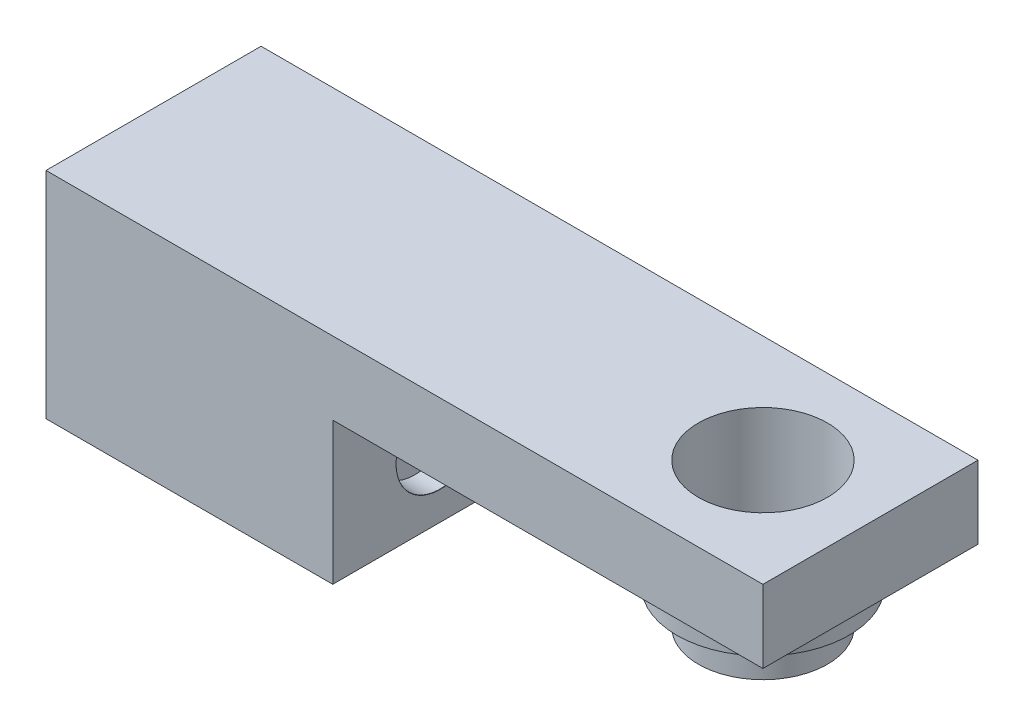
ISO-10303-21;
HEADER;
FILE_DESCRIPTION(('STEP AP214'),'2;1');
FILE_NAME('part.step','',(''),(''),'','','');
FILE_SCHEMA(('AUTOMOTIVE_DESIGN { 1 0 10303 214 1 1 1 1 }'));
ENDSEC;
DATA;
#1=APPLICATION_CONTEXT('core data for automotive mechanical design processes');
#2=APPLICATION_PROTOCOL_DEFINITION('international standard','automotive_design',2000,#1);
#3=PRODUCT_CONTEXT('',#1,'mechanical');
#4=PRODUCT('Part','Part','',(#3));
#5=PRODUCT_RELATED_PRODUCT_CATEGORY('part','',(#4));
#6=PRODUCT_DEFINITION_FORMATION('','',#4);
#7=PRODUCT_DEFINITION_CONTEXT('part definition',#1,'design');
#8=PRODUCT_DEFINITION('design','',#6,#7);
#9=PRODUCT_DEFINITION_SHAPE('','',#8);
#10=(LENGTH_UNIT() NAMED_UNIT(*) SI_UNIT(.MILLI.,.METRE.));
#11=(NAMED_UNIT(*) PLANE_ANGLE_UNIT() SI_UNIT($,.RADIAN.));
#12=(NAMED_UNIT(*) SI_UNIT($,.STERADIAN.) SOLID_ANGLE_UNIT());
#13=UNCERTAINTY_MEASURE_WITH_UNIT(LENGTH_MEASURE(1.E-05),#10,'distance_accuracy_value','');
#14=(GEOMETRIC_REPRESENTATION_CONTEXT(3) GLOBAL_UNCERTAINTY_ASSIGNED_CONTEXT((#13)) GLOBAL_UNIT_ASSIGNED_CONTEXT((#10,
#11,#12)) REPRESENTATION_CONTEXT('',''));
#15=CARTESIAN_POINT('',(0.,0.,0.));
#16=DIRECTION('',(0.,0.,1.));
#17=DIRECTION('',(1.,0.,0.));
#18=AXIS2_PLACEMENT_3D('',#15,#16,#17);
#19=CARTESIAN_POINT('',(40.,0.,0.));
#20=DIRECTION('',(-1.,0.,0.));
#21=DIRECTION('',(0.,0.,1.));
#22=AXIS2_PLACEMENT_3D('',#19,#20,#21);
#23=PLANE('',#22);
#24=CARTESIAN_POINT('',(40.,2.48247175305494,24.681970174111));
#25=DIRECTION('',(1.,0.,0.));
#26=DIRECTION('',(0.,0.,-1.));
#27=AXIS2_PLACEMENT_3D('',#24,#25,#26);
#28=CIRCLE('',#27,6.144);
#29=CARTESIAN_POINT('',(40.,2.48247175305494,18.537970174111));
#30=VERTEX_POINT('',#29);
#31=EDGE_CURVE('E244',#30,#30,#28,.T.);
#32=ORIENTED_EDGE('',*,*,#31,.F.);
#33=EDGE_LOOP('',(#32));
#34=FACE_BOUND('',#33,.T.);
#35=DIRECTION('',(0.,0.,-1.));
#36=VECTOR('',#35,1.);
#37=CARTESIAN_POINT('',(40.,12.1952160658731,39.6578468441171));
#38=LINE('',#37,#36);
#39=CARTESIAN_POINT('',(40.,12.1952160658731,39.6578468441171));
#40=VERTEX_POINT('',#39);
#41=CARTESIAN_POINT('',(40.,12.1952160658731,9.65784684411711));
#42=VERTEX_POINT('',#41);
#43=EDGE_CURVE('E50',#40,#42,#38,.T.);
#44=ORIENTED_EDGE('',*,*,#43,.F.);
#45=DIRECTION('',(0.,-1.,0.));
#46=VECTOR('',#45,1.);
#47=CARTESIAN_POINT('',(40.,-7.63901148226845,39.6578468441171));
#48=LINE('',#47,#46);
#49=CARTESIAN_POINT('',(40.,-7.63901148226845,39.6578468441171));
#50=VERTEX_POINT('',#49);
#51=EDGE_CURVE('E87',#40,#50,#48,.T.);
#52=ORIENTED_EDGE('',*,*,#51,.T.);
#53=DIRECTION('',(0.,0.,-1.));
#54=VECTOR('',#53,1.);
#55=CARTESIAN_POINT('',(40.,-7.63901148226845,39.6578468441171));
#56=LINE('',#55,#54);
#57=CARTESIAN_POINT('',(40.,-7.63901148226845,9.65784684411711));
#58=VERTEX_POINT('',#57);
#59=EDGE_CURVE('E56',#50,#58,#56,.T.);
#60=ORIENTED_EDGE('',*,*,#59,.T.);
#61=DIRECTION('',(0.,1.,0.));
#62=VECTOR('',#61,1.);
#63=CARTESIAN_POINT('',(40.,-7.63901148226845,9.65784684411711));
#64=LINE('',#63,#62);
#65=EDGE_CURVE('E98',#58,#42,#64,.T.);
#66=ORIENTED_EDGE('',*,*,#65,.T.);
#67=EDGE_LOOP('',(#44,#52,#60,#66));
#68=FACE_BOUND('',#67,.T.);
#69=ADVANCED_FACE('F35',(#34,#68),#23,.F.);
#70=CARTESIAN_POINT('',(40.,-7.63901148226845,39.6578468441171));
#71=DIRECTION('',(0.,0.,-1.));
#72=DIRECTION('',(-1.,0.,0.));
#73=AXIS2_PLACEMENT_3D('',#70,#71,#72);
#74=PLANE('',#73);
#75=DIRECTION('',(0.,-1.,0.));
#76=VECTOR('',#75,1.);
#77=CARTESIAN_POINT('',(0.,-7.63901148226845,39.6578468441171));
#78=LINE('',#77,#76);
#79=CARTESIAN_POINT('',(0.,22.3609885177315,39.6578468441171));
#80=VERTEX_POINT('',#79);
#81=CARTESIAN_POINT('',(0.,-7.63901148226845,39.6578468441171));
#82=VERTEX_POINT('',#81);
#83=EDGE_CURVE('E94',#80,#82,#78,.T.);
#84=ORIENTED_EDGE('',*,*,#83,.T.);
#85=DIRECTION('',(-1.,0.,0.));
#86=VECTOR('',#85,1.);
#87=CARTESIAN_POINT('',(40.,-7.63901148226845,39.6578468441171));
#88=LINE('',#87,#86);
#89=EDGE_CURVE('E43',#50,#82,#88,.T.);
#90=ORIENTED_EDGE('',*,*,#89,.F.);
#91=ORIENTED_EDGE('',*,*,#51,.F.);
#92=DIRECTION('',(-1.,0.,0.));
#93=VECTOR('',#92,1.);
#94=CARTESIAN_POINT('',(100.,12.1952160658731,39.6578468441171));
#95=LINE('',#94,#93);
#96=CARTESIAN_POINT('',(100.,12.1952160658731,39.6578468441171));
#97=VERTEX_POINT('',#96);
#98=EDGE_CURVE('E103',#97,#40,#95,.T.);
#99=ORIENTED_EDGE('',*,*,#98,.F.);
#100=DIRECTION('',(0.,-1.,0.));
#101=VECTOR('',#100,1.);
#102=CARTESIAN_POINT('',(100.,22.3609885177315,39.6578468441171));
#103=LINE('',#102,#101);
#104=CARTESIAN_POINT('',(100.,22.3609885177315,39.6578468441171));
#105=VERTEX_POINT('',#104);
#106=EDGE_CURVE('E97',#105,#97,#103,.T.);
#107=ORIENTED_EDGE('',*,*,#106,.F.);
#108=DIRECTION('',(-1.,0.,0.));
#109=VECTOR('',#108,1.);
#110=CARTESIAN_POINT('',(40.,22.3609885177315,39.6578468441171));
#111=LINE('',#110,#109);
#112=EDGE_CURVE('E80',#105,#80,#111,.T.);
#113=ORIENTED_EDGE('',*,*,#112,.T.);
#114=EDGE_LOOP('',(#84,#90,#91,#99,#107,#113));
#115=FACE_BOUND('',#114,.T.);
#116=ADVANCED_FACE('F37',(#115),#74,.F.);
#117=CARTESIAN_POINT('',(40.,-7.63901148226845,39.6578468441171));
#118=DIRECTION('',(0.,1.,0.));
#119=DIRECTION('',(0.,0.,1.));
#120=AXIS2_PLACEMENT_3D('',#117,#118,#119);
#121=PLANE('',#120);
#122=DIRECTION('',(0.,0.,-1.));
#123=VECTOR('',#122,1.);
#124=CARTESIAN_POINT('',(0.,-7.63901148226845,39.6578468441171));
#125=LINE('',#124,#123);
#126=CARTESIAN_POINT('',(0.,-7.63901148226845,9.65784684411711));
#127=VERTEX_POINT('',#126);
#128=EDGE_CURVE('E101',#82,#127,#125,.T.);
#129=ORIENTED_EDGE('',*,*,#128,.T.);
#130=DIRECTION('',(-1.,0.,0.));
#131=VECTOR('',#130,1.);
#132=CARTESIAN_POINT('',(40.,-7.63901148226845,9.65784684411711));
#133=LINE('',#132,#131);
#134=EDGE_CURVE('E114',#58,#127,#133,.T.);
#135=ORIENTED_EDGE('',*,*,#134,.F.);
#136=ORIENTED_EDGE('',*,*,#59,.F.);
#137=ORIENTED_EDGE('',*,*,#89,.T.);
#138=EDGE_LOOP('',(#129,#135,#136,#137));
#139=FACE_BOUND('',#138,.T.);
#140=ADVANCED_FACE('F117',(#139),#121,.F.);
#141=CARTESIAN_POINT('',(40.,-7.63901148226845,9.65784684411711));
#142=DIRECTION('',(0.,0.,1.));
#143=DIRECTION('',(1.,0.,0.));
#144=AXIS2_PLACEMENT_3D('',#141,#142,#143);
#145=PLANE('',#144);
#146=DIRECTION('',(0.,1.,0.));
#147=VECTOR('',#146,1.);
#148=CARTESIAN_POINT('',(0.,-7.63901148226845,9.65784684411711));
#149=LINE('',#148,#147);
#150=CARTESIAN_POINT('',(0.,22.3609885177315,9.65784684411711));
#151=VERTEX_POINT('',#150);
#152=EDGE_CURVE('E88',#127,#151,#149,.T.);
#153=ORIENTED_EDGE('',*,*,#152,.T.);
#154=DIRECTION('',(-1.,0.,0.));
#155=VECTOR('',#154,1.);
#156=CARTESIAN_POINT('',(40.,22.3609885177315,9.65784684411711));
#157=LINE('',#156,#155);
#158=CARTESIAN_POINT('',(100.,22.3609885177315,9.65784684411711));
#159=VERTEX_POINT('',#158);
#160=EDGE_CURVE('E83',#159,#151,#157,.T.);
#161=ORIENTED_EDGE('',*,*,#160,.F.);
#162=DIRECTION('',(0.,1.,0.));
#163=VECTOR('',#162,1.);
#164=CARTESIAN_POINT('',(100.,22.3609885177315,9.65784684411711));
#165=LINE('',#164,#163);
#166=CARTESIAN_POINT('',(100.,12.1952160658731,9.65784684411711));
#167=VERTEX_POINT('',#166);
#168=EDGE_CURVE('E133',#167,#159,#165,.T.);
#169=ORIENTED_EDGE('',*,*,#168,.F.);
#170=DIRECTION('',(-1.,0.,0.));
#171=VECTOR('',#170,1.);
#172=CARTESIAN_POINT('',(100.,12.1952160658731,9.65784684411711));
#173=LINE('',#172,#171);
#174=EDGE_CURVE('E107',#167,#42,#173,.T.);
#175=ORIENTED_EDGE('',*,*,#174,.T.);
#176=ORIENTED_EDGE('',*,*,#65,.F.);
#177=ORIENTED_EDGE('',*,*,#134,.T.);
#178=EDGE_LOOP('',(#153,#161,#169,#175,#176,#177));
#179=FACE_BOUND('',#178,.T.);
#180=ADVANCED_FACE('F147',(#179),#145,.F.);
#181=CARTESIAN_POINT('',(40.,22.3609885177315,39.6578468441171));
#182=DIRECTION('',(0.,-1.,0.));
#183=DIRECTION('',(0.,0.,-1.));
#184=AXIS2_PLACEMENT_3D('',#181,#182,#183);
#185=PLANE('',#184);
#186=CARTESIAN_POINT('',(85.,22.3609885177315,24.6578468441171));
#187=DIRECTION('',(0.,1.,0.));
#188=DIRECTION('',(0.,0.,1.));
#189=AXIS2_PLACEMENT_3D('',#186,#187,#188);
#190=CIRCLE('',#189,9.);
#191=CARTESIAN_POINT('',(85.,22.3609885177315,33.6578468441171));
#192=VERTEX_POINT('',#191);
#193=EDGE_CURVE('E245',#192,#192,#190,.T.);
#194=ORIENTED_EDGE('',*,*,#193,.F.);
#195=EDGE_LOOP('',(#194));
#196=FACE_BOUND('',#195,.T.);
#197=DIRECTION('',(0.,0.,1.));
#198=VECTOR('',#197,1.);
#199=CARTESIAN_POINT('',(0.,22.3609885177315,39.6578468441171));
#200=LINE('',#199,#198);
#201=EDGE_CURVE('E76',#151,#80,#200,.T.);
#202=ORIENTED_EDGE('',*,*,#201,.T.);
#203=ORIENTED_EDGE('',*,*,#112,.F.);
#204=DIRECTION('',(0.,0.,1.));
#205=VECTOR('',#204,1.);
#206=CARTESIAN_POINT('',(100.,22.3609885177315,39.6578468441171));
#207=LINE('',#206,#205);
#208=EDGE_CURVE('E136',#159,#105,#207,.T.);
#209=ORIENTED_EDGE('',*,*,#208,.F.);
#210=ORIENTED_EDGE('',*,*,#160,.T.);
#211=EDGE_LOOP('',(#202,#203,#209,#210));
#212=FACE_BOUND('',#211,.T.);
#213=ADVANCED_FACE('F78',(#196,#212),#185,.F.);
#214=CARTESIAN_POINT('',(0.,0.,0.));
#215=DIRECTION('',(-1.,0.,0.));
#216=DIRECTION('',(0.,0.,1.));
#217=AXIS2_PLACEMENT_3D('',#214,#215,#216);
#218=PLANE('',#217);
#219=CARTESIAN_POINT('',(0.,2.48247175305494,24.681970174111));
#220=DIRECTION('',(1.,0.,0.));
#221=DIRECTION('',(0.,0.,-1.));
#222=AXIS2_PLACEMENT_3D('',#219,#220,#221);
#223=CIRCLE('',#222,2.74999999999999);
#224=CARTESIAN_POINT('',(0.,2.48247175305494,21.931970174111));
#225=VERTEX_POINT('',#224);
#226=EDGE_CURVE('E178',#225,#225,#223,.T.);
#227=ORIENTED_EDGE('',*,*,#226,.T.);
#228=EDGE_LOOP('',(#227));
#229=FACE_BOUND('',#228,.T.);
#230=ORIENTED_EDGE('',*,*,#83,.F.);
#231=ORIENTED_EDGE('',*,*,#201,.F.);
#232=ORIENTED_EDGE('',*,*,#152,.F.);
#233=ORIENTED_EDGE('',*,*,#128,.F.);
#234=EDGE_LOOP('',(#230,#231,#232,#233));
#235=FACE_BOUND('',#234,.T.);
#236=ADVANCED_FACE('F100',(#229,#235),#218,.T.);
#237=CARTESIAN_POINT('',(100.,12.1952160658731,39.6578468441171));
#238=DIRECTION('',(0.,1.,0.));
#239=DIRECTION('',(0.,0.,1.));
#240=AXIS2_PLACEMENT_3D('',#237,#238,#239);
#241=PLANE('',#240);
#242=CARTESIAN_POINT('',(85.,12.1952160658731,24.6578468441171));
#243=DIRECTION('',(0.,1.,0.));
#244=DIRECTION('',(0.,0.,1.));
#245=AXIS2_PLACEMENT_3D('',#242,#243,#244);
#246=CIRCLE('',#245,12.);
#247=CARTESIAN_POINT('',(85.,12.1952160658731,36.6578468441171));
#248=VERTEX_POINT('',#247);
#249=EDGE_CURVE('E11',#248,#248,#246,.F.);
#250=ORIENTED_EDGE('',*,*,#249,.F.);
#251=EDGE_LOOP('',(#250));
#252=FACE_BOUND('',#251,.T.);
#253=ORIENTED_EDGE('',*,*,#43,.T.);
#254=ORIENTED_EDGE('',*,*,#174,.F.);
#255=DIRECTION('',(0.,0.,-1.));
#256=VECTOR('',#255,1.);
#257=CARTESIAN_POINT('',(100.,12.1952160658731,39.6578468441171));
#258=LINE('',#257,#256);
#259=EDGE_CURVE('E127',#97,#167,#258,.T.);
#260=ORIENTED_EDGE('',*,*,#259,.F.);
#261=ORIENTED_EDGE('',*,*,#98,.T.);
#262=EDGE_LOOP('',(#253,#254,#260,#261));
#263=FACE_BOUND('',#262,.T.);
#264=ADVANCED_FACE('F122',(#252,#263),#241,.F.);
#265=CARTESIAN_POINT('',(100.,0.,0.));
#266=DIRECTION('',(1.,0.,0.));
#267=DIRECTION('',(0.,0.,-1.));
#268=AXIS2_PLACEMENT_3D('',#265,#266,#267);
#269=PLANE('',#268);
#270=ORIENTED_EDGE('',*,*,#106,.T.);
#271=ORIENTED_EDGE('',*,*,#259,.T.);
#272=ORIENTED_EDGE('',*,*,#168,.T.);
#273=ORIENTED_EDGE('',*,*,#208,.T.);
#274=EDGE_LOOP('',(#270,#271,#272,#273));
#275=FACE_BOUND('',#274,.T.);
#276=ADVANCED_FACE('F135',(#275),#269,.T.);
#277=CARTESIAN_POINT('',(85.,7.19521606587315,24.6578468441171));
#278=DIRECTION('',(0.,1.,0.));
#279=DIRECTION('',(0.,0.,1.));
#280=AXIS2_PLACEMENT_3D('',#277,#278,#279);
#281=CYLINDRICAL_SURFACE('',#280,12.);
#282=CARTESIAN_POINT('',(85.,7.19521606587315,24.6578468441171));
#283=DIRECTION('',(0.,-1.,0.));
#284=DIRECTION('',(0.,0.,-1.));
#285=AXIS2_PLACEMENT_3D('',#282,#283,#284);
#286=CIRCLE('',#285,12.);
#287=CARTESIAN_POINT('',(85.,7.19521606587315,12.6578468441171));
#288=VERTEX_POINT('',#287);
#289=EDGE_CURVE('E138',#288,#288,#286,.T.);
#290=ORIENTED_EDGE('',*,*,#289,.F.);
#291=EDGE_LOOP('',(#290));
#292=FACE_BOUND('',#291,.T.);
#293=ORIENTED_EDGE('',*,*,#249,.T.);
#294=EDGE_LOOP('',(#293));
#295=FACE_BOUND('',#294,.T.);
#296=ADVANCED_FACE('F198',(#292,#295),#281,.T.);
#297=CARTESIAN_POINT('',(85.,7.19521606587315,24.6578468441171));
#298=DIRECTION('',(0.,-1.,0.));
#299=DIRECTION('',(0.,0.,-1.));
#300=AXIS2_PLACEMENT_3D('',#297,#298,#299);
#301=PLANE('',#300);
#302=CARTESIAN_POINT('',(85.,7.19521606587315,24.6578468441171));
#303=DIRECTION('',(0.,-1.,0.));
#304=DIRECTION('',(0.,0.,-1.));
#305=AXIS2_PLACEMENT_3D('',#302,#303,#304);
#306=CIRCLE('',#305,9.);
#307=CARTESIAN_POINT('',(85.,7.19521606587315,15.6578468441171));
#308=VERTEX_POINT('',#307);
#309=EDGE_CURVE('E180',#308,#308,#306,.T.);
#310=ORIENTED_EDGE('',*,*,#309,.F.);
#311=EDGE_LOOP('',(#310));
#312=FACE_BOUND('',#311,.T.);
#313=ORIENTED_EDGE('',*,*,#289,.T.);
#314=EDGE_LOOP('',(#313));
#315=FACE_BOUND('',#314,.T.);
#316=ADVANCED_FACE('F196',(#312,#315),#301,.T.);
#317=CARTESIAN_POINT('',(85.,2.19521606587315,24.6578468441171));
#318=DIRECTION('',(0.,1.,0.));
#319=DIRECTION('',(0.,0.,1.));
#320=AXIS2_PLACEMENT_3D('',#317,#318,#319);
#321=CYLINDRICAL_SURFACE('',#320,9.);
#322=CARTESIAN_POINT('',(85.,2.19521606587315,24.6578468441171));
#323=DIRECTION('',(0.,-1.,0.));
#324=DIRECTION('',(0.,0.,-1.));
#325=AXIS2_PLACEMENT_3D('',#322,#323,#324);
#326=CIRCLE('',#325,9.);
#327=CARTESIAN_POINT('',(85.,2.19521606587315,15.6578468441171));
#328=VERTEX_POINT('',#327);
#329=EDGE_CURVE('E184',#328,#328,#326,.T.);
#330=ORIENTED_EDGE('',*,*,#329,.F.);
#331=EDGE_LOOP('',(#330));
#332=FACE_BOUND('',#331,.T.);
#333=ORIENTED_EDGE('',*,*,#309,.T.);
#334=EDGE_LOOP('',(#333));
#335=FACE_BOUND('',#334,.T.);
#336=ADVANCED_FACE('F207',(#332,#335),#321,.T.);
#337=CARTESIAN_POINT('',(85.,2.19521606587315,24.6578468441171));
#338=DIRECTION('',(0.,-1.,0.));
#339=DIRECTION('',(0.,0.,-1.));
#340=AXIS2_PLACEMENT_3D('',#337,#338,#339);
#341=PLANE('',#340);
#342=ORIENTED_EDGE('',*,*,#329,.T.);
#343=EDGE_LOOP('',(#342));
#344=FACE_BOUND('',#343,.T.);
#345=ADVANCED_FACE('F213',(#344),#341,.T.);
#346=CARTESIAN_POINT('',(40.,2.48247175305494,24.681970174111));
#347=DIRECTION('',(1.,0.,0.));
#348=DIRECTION('',(0.,0.,-1.));
#349=AXIS2_PLACEMENT_3D('',#346,#347,#348);
#350=CYLINDRICAL_SURFACE('',#349,2.75);
#351=ORIENTED_EDGE('',*,*,#226,.F.);
#352=EDGE_LOOP('',(#351));
#353=FACE_BOUND('',#352,.T.);
#354=CARTESIAN_POINT('',(36.5,2.48247175305494,24.681970174111));
#355=DIRECTION('',(1.,0.,0.));
#356=DIRECTION('',(0.,0.,-1.));
#357=AXIS2_PLACEMENT_3D('',#354,#355,#356);
#358=CIRCLE('',#357,2.75);
#359=CARTESIAN_POINT('',(36.5,2.48247175305494,21.931970174111));
#360=VERTEX_POINT('',#359);
#361=EDGE_CURVE('E181',#360,#360,#358,.T.);
#362=ORIENTED_EDGE('',*,*,#361,.T.);
#363=EDGE_LOOP('',(#362));
#364=FACE_BOUND('',#363,.T.);
#365=ADVANCED_FACE('F217',(#353,#364),#350,.F.);
#366=CARTESIAN_POINT('',(36.5,8.60147175305494,24.681970174111));
#367=DIRECTION('',(-1.,0.,0.));
#368=DIRECTION('',(0.,0.,1.));
#369=AXIS2_PLACEMENT_3D('',#366,#367,#368);
#370=PLANE('',#369);
#371=ORIENTED_EDGE('',*,*,#361,.F.);
#372=EDGE_LOOP('',(#371));
#373=FACE_BOUND('',#372,.T.);
#374=CARTESIAN_POINT('',(36.5,2.48247175305494,24.681970174111));
#375=DIRECTION('',(1.,0.,0.));
#376=DIRECTION('',(0.,0.,-1.));
#377=AXIS2_PLACEMENT_3D('',#374,#375,#376);
#378=CIRCLE('',#377,6.119);
#379=CARTESIAN_POINT('',(36.5,2.48247175305494,18.562970174111));
#380=VERTEX_POINT('',#379);
#381=EDGE_CURVE('E186',#380,#380,#378,.T.);
#382=ORIENTED_EDGE('',*,*,#381,.T.);
#383=EDGE_LOOP('',(#382));
#384=FACE_BOUND('',#383,.T.);
#385=ADVANCED_FACE('F220',(#373,#384),#370,.F.);
#386=CARTESIAN_POINT('',(40.,2.48247175305494,24.681970174111));
#387=DIRECTION('',(1.,0.,0.));
#388=DIRECTION('',(0.,0.,-1.));
#389=AXIS2_PLACEMENT_3D('',#386,#387,#388);
#390=CYLINDRICAL_SURFACE('',#389,6.119);
#391=ORIENTED_EDGE('',*,*,#381,.F.);
#392=EDGE_LOOP('',(#391));
#393=FACE_BOUND('',#392,.T.);
#394=CARTESIAN_POINT('',(39.975,2.48247175305494,24.681970174111));
#395=DIRECTION('',(1.,0.,0.));
#396=DIRECTION('',(0.,0.,-1.));
#397=AXIS2_PLACEMENT_3D('',#394,#395,#396);
#398=CIRCLE('',#397,6.119);
#399=CARTESIAN_POINT('',(39.975,2.48247175305494,18.562970174111));
#400=VERTEX_POINT('',#399);
#401=EDGE_CURVE('E248',#400,#400,#398,.T.);
#402=ORIENTED_EDGE('',*,*,#401,.T.);
#403=EDGE_LOOP('',(#402));
#404=FACE_BOUND('',#403,.T.);
#405=ADVANCED_FACE('F223',(#393,#404),#390,.F.);
#406=CARTESIAN_POINT('',(40.,2.48247175305494,24.681970174111));
#407=DIRECTION('',(1.,0.,0.));
#408=DIRECTION('',(0.,0.,-1.));
#409=AXIS2_PLACEMENT_3D('',#406,#407,#408);
#410=CONICAL_SURFACE('',#409,6.144,0.785398163397448);
#411=ORIENTED_EDGE('',*,*,#401,.F.);
#412=EDGE_LOOP('',(#411));
#413=FACE_BOUND('',#412,.T.);
#414=ORIENTED_EDGE('',*,*,#31,.T.);
#415=EDGE_LOOP('',(#414));
#416=FACE_BOUND('',#415,.T.);
#417=ADVANCED_FACE('F227',(#413,#416),#410,.F.);
#418=CARTESIAN_POINT('',(85.,7.36098851773155,24.6578468441171));
#419=DIRECTION('',(0.,1.,0.));
#420=DIRECTION('',(0.,0.,1.));
#421=AXIS2_PLACEMENT_3D('',#418,#419,#420);
#422=CYLINDRICAL_SURFACE('',#421,9.);
#423=CARTESIAN_POINT('',(85.,7.36098851773155,24.6578468441171));
#424=DIRECTION('',(0.,1.,0.));
#425=DIRECTION('',(0.,0.,1.));
#426=AXIS2_PLACEMENT_3D('',#423,#424,#425);
#427=CIRCLE('',#426,9.);
#428=CARTESIAN_POINT('',(85.,7.36098851773155,33.6578468441171));
#429=VERTEX_POINT('',#428);
#430=EDGE_CURVE('E243',#429,#429,#427,.T.);
#431=ORIENTED_EDGE('',*,*,#430,.F.);
#432=EDGE_LOOP('',(#431));
#433=FACE_BOUND('',#432,.T.);
#434=ORIENTED_EDGE('',*,*,#193,.T.);
#435=EDGE_LOOP('',(#434));
#436=FACE_BOUND('',#435,.T.);
#437=ADVANCED_FACE('F231',(#433,#436),#422,.F.);
#438=CARTESIAN_POINT('',(85.,7.36098851773155,24.6578468441171));
#439=DIRECTION('',(0.,1.,0.));
#440=DIRECTION('',(0.,0.,1.));
#441=AXIS2_PLACEMENT_3D('',#438,#439,#440);
#442=PLANE('',#441);
#443=ORIENTED_EDGE('',*,*,#430,.T.);
#444=EDGE_LOOP('',(#443));
#445=FACE_BOUND('',#444,.T.);
#446=ADVANCED_FACE('F235',(#445),#442,.T.);
#447=CLOSED_SHELL('',(#69,#116,#140,#180,#213,#236,#264,#276,#296,#316,#336,#345,#365,#385,#405,
#417,#437,#446));
#448=MANIFOLD_SOLID_BREP('B2',#447);
#449=ADVANCED_BREP_SHAPE_REPRESENTATION('',(#18,#448),#14);
#450=SHAPE_DEFINITION_REPRESENTATION(#9,#449);
ENDSEC;
END-ISO-10303-21;
